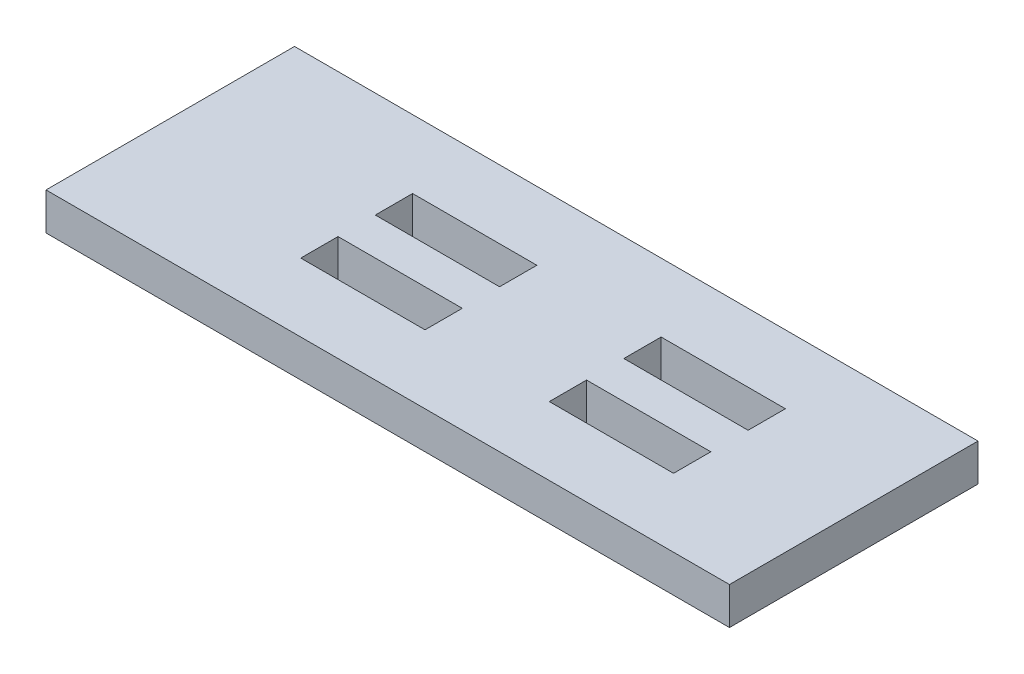
ISO-10303-21;
HEADER;
FILE_DESCRIPTION(('STEP AP214'),'2;1');
FILE_NAME('part.step','',(''),(''),'','','');
FILE_SCHEMA(('AUTOMOTIVE_DESIGN { 1 0 10303 214 1 1 1 1 }'));
ENDSEC;
DATA;
#1=APPLICATION_CONTEXT('core data for automotive mechanical design processes');
#2=APPLICATION_PROTOCOL_DEFINITION('international standard','automotive_design',2000,#1);
#3=PRODUCT_CONTEXT('',#1,'mechanical');
#4=PRODUCT('Part','Part','',(#3));
#5=PRODUCT_RELATED_PRODUCT_CATEGORY('part','',(#4));
#6=PRODUCT_DEFINITION_FORMATION('','',#4);
#7=PRODUCT_DEFINITION_CONTEXT('part definition',#1,'design');
#8=PRODUCT_DEFINITION('design','',#6,#7);
#9=PRODUCT_DEFINITION_SHAPE('','',#8);
#10=(LENGTH_UNIT() NAMED_UNIT(*) SI_UNIT(.MILLI.,.METRE.));
#11=(NAMED_UNIT(*) PLANE_ANGLE_UNIT() SI_UNIT($,.RADIAN.));
#12=(NAMED_UNIT(*) SI_UNIT($,.STERADIAN.) SOLID_ANGLE_UNIT());
#13=UNCERTAINTY_MEASURE_WITH_UNIT(LENGTH_MEASURE(1.E-05),#10,'distance_accuracy_value','');
#14=(GEOMETRIC_REPRESENTATION_CONTEXT(3) GLOBAL_UNCERTAINTY_ASSIGNED_CONTEXT((#13)) GLOBAL_UNIT_ASSIGNED_CONTEXT((#10,
#11,#12)) REPRESENTATION_CONTEXT('',''));
#15=CARTESIAN_POINT('',(0.,0.,0.));
#16=DIRECTION('',(0.,0.,1.));
#17=DIRECTION('',(1.,0.,0.));
#18=AXIS2_PLACEMENT_3D('',#15,#16,#17);
#19=CARTESIAN_POINT('',(0.,3.,0.));
#20=DIRECTION('',(-1.,0.,0.));
#21=DIRECTION('',(0.,0.,1.));
#22=AXIS2_PLACEMENT_3D('',#19,#20,#21);
#23=PLANE('',#22);
#24=DIRECTION('',(0.,0.,-1.));
#25=VECTOR('',#24,1.);
#26=CARTESIAN_POINT('',(0.,0.,0.));
#27=LINE('',#26,#25);
#28=CARTESIAN_POINT('',(0.,0.,0.));
#29=VERTEX_POINT('',#28);
#30=CARTESIAN_POINT('',(0.,0.,-20.));
#31=VERTEX_POINT('',#30);
#32=EDGE_CURVE('E296',#29,#31,#27,.T.);
#33=ORIENTED_EDGE('',*,*,#32,.T.);
#34=DIRECTION('',(0.,-1.,0.));
#35=VECTOR('',#34,1.);
#36=CARTESIAN_POINT('',(0.,3.,-20.));
#37=LINE('',#36,#35);
#38=CARTESIAN_POINT('',(0.,3.,-20.));
#39=VERTEX_POINT('',#38);
#40=EDGE_CURVE('E11',#39,#31,#37,.T.);
#41=ORIENTED_EDGE('',*,*,#40,.F.);
#42=DIRECTION('',(0.,0.,-1.));
#43=VECTOR('',#42,1.);
#44=CARTESIAN_POINT('',(0.,3.,0.));
#45=LINE('',#44,#43);
#46=CARTESIAN_POINT('',(0.,3.,0.));
#47=VERTEX_POINT('',#46);
#48=EDGE_CURVE('E303',#47,#39,#45,.T.);
#49=ORIENTED_EDGE('',*,*,#48,.F.);
#50=DIRECTION('',(0.,-1.,0.));
#51=VECTOR('',#50,1.);
#52=CARTESIAN_POINT('',(0.,3.,0.));
#53=LINE('',#52,#51);
#54=EDGE_CURVE('E313',#47,#29,#53,.T.);
#55=ORIENTED_EDGE('',*,*,#54,.T.);
#56=EDGE_LOOP('',(#33,#41,#49,#55));
#57=FACE_BOUND('',#56,.T.);
#58=ADVANCED_FACE('F34',(#57),#23,.F.);
#59=CARTESIAN_POINT('',(0.,3.,-20.));
#60=DIRECTION('',(0.,0.,1.));
#61=DIRECTION('',(1.,0.,0.));
#62=AXIS2_PLACEMENT_3D('',#59,#60,#61);
#63=PLANE('',#62);
#64=DIRECTION('',(-1.,0.,0.));
#65=VECTOR('',#64,1.);
#66=CARTESIAN_POINT('',(0.,0.,-20.));
#67=LINE('',#66,#65);
#68=CARTESIAN_POINT('',(-55.,0.,-20.));
#69=VERTEX_POINT('',#68);
#70=EDGE_CURVE('E316',#31,#69,#67,.T.);
#71=ORIENTED_EDGE('',*,*,#70,.T.);
#72=DIRECTION('',(0.,-1.,0.));
#73=VECTOR('',#72,1.);
#74=CARTESIAN_POINT('',(-55.,3.,-20.));
#75=LINE('',#74,#73);
#76=CARTESIAN_POINT('',(-55.,3.,-20.));
#77=VERTEX_POINT('',#76);
#78=EDGE_CURVE('E41',#77,#69,#75,.T.);
#79=ORIENTED_EDGE('',*,*,#78,.F.);
#80=DIRECTION('',(-1.,0.,0.));
#81=VECTOR('',#80,1.);
#82=CARTESIAN_POINT('',(0.,3.,-20.));
#83=LINE('',#82,#81);
#84=EDGE_CURVE('E306',#39,#77,#83,.T.);
#85=ORIENTED_EDGE('',*,*,#84,.F.);
#86=ORIENTED_EDGE('',*,*,#40,.T.);
#87=EDGE_LOOP('',(#71,#79,#85,#86));
#88=FACE_BOUND('',#87,.T.);
#89=ADVANCED_FACE('F345',(#88),#63,.F.);
#90=CARTESIAN_POINT('',(-55.,3.,0.));
#91=DIRECTION('',(1.,0.,0.));
#92=DIRECTION('',(0.,0.,-1.));
#93=AXIS2_PLACEMENT_3D('',#90,#91,#92);
#94=PLANE('',#93);
#95=DIRECTION('',(0.,0.,1.));
#96=VECTOR('',#95,1.);
#97=CARTESIAN_POINT('',(-55.,0.,0.));
#98=LINE('',#97,#96);
#99=CARTESIAN_POINT('',(-55.,0.,0.));
#100=VERTEX_POINT('',#99);
#101=EDGE_CURVE('E318',#69,#100,#98,.T.);
#102=ORIENTED_EDGE('',*,*,#101,.T.);
#103=DIRECTION('',(0.,-1.,0.));
#104=VECTOR('',#103,1.);
#105=CARTESIAN_POINT('',(-55.,3.,0.));
#106=LINE('',#105,#104);
#107=CARTESIAN_POINT('',(-55.,3.,0.));
#108=VERTEX_POINT('',#107);
#109=EDGE_CURVE('E323',#108,#100,#106,.T.);
#110=ORIENTED_EDGE('',*,*,#109,.F.);
#111=DIRECTION('',(0.,0.,1.));
#112=VECTOR('',#111,1.);
#113=CARTESIAN_POINT('',(-55.,3.,0.));
#114=LINE('',#113,#112);
#115=EDGE_CURVE('E309',#77,#108,#114,.T.);
#116=ORIENTED_EDGE('',*,*,#115,.F.);
#117=ORIENTED_EDGE('',*,*,#78,.T.);
#118=EDGE_LOOP('',(#102,#110,#116,#117));
#119=FACE_BOUND('',#118,.T.);
#120=ADVANCED_FACE('F330',(#119),#94,.F.);
#121=CARTESIAN_POINT('',(0.,3.,0.));
#122=DIRECTION('',(0.,0.,-1.));
#123=DIRECTION('',(-1.,0.,0.));
#124=AXIS2_PLACEMENT_3D('',#121,#122,#123);
#125=PLANE('',#124);
#126=DIRECTION('',(1.,0.,0.));
#127=VECTOR('',#126,1.);
#128=CARTESIAN_POINT('',(0.,0.,0.));
#129=LINE('',#128,#127);
#130=EDGE_CURVE('E307',#100,#29,#129,.T.);
#131=ORIENTED_EDGE('',*,*,#130,.T.);
#132=ORIENTED_EDGE('',*,*,#54,.F.);
#133=DIRECTION('',(1.,0.,0.));
#134=VECTOR('',#133,1.);
#135=CARTESIAN_POINT('',(0.,3.,0.));
#136=LINE('',#135,#134);
#137=EDGE_CURVE('E311',#108,#47,#136,.T.);
#138=ORIENTED_EDGE('',*,*,#137,.F.);
#139=ORIENTED_EDGE('',*,*,#109,.T.);
#140=EDGE_LOOP('',(#131,#132,#138,#139));
#141=FACE_BOUND('',#140,.T.);
#142=ADVANCED_FACE('F338',(#141),#125,.F.);
#143=CARTESIAN_POINT('',(0.,3.,0.));
#144=DIRECTION('',(0.,1.,0.));
#145=DIRECTION('',(0.,0.,1.));
#146=AXIS2_PLACEMENT_3D('',#143,#144,#145);
#147=PLANE('',#146);
#148=DIRECTION('',(0.,0.,-1.));
#149=VECTOR('',#148,1.);
#150=CARTESIAN_POINT('',(-30.,3.,-5.5));
#151=LINE('',#150,#149);
#152=CARTESIAN_POINT('',(-30.,3.,-5.5));
#153=VERTEX_POINT('',#152);
#154=CARTESIAN_POINT('',(-30.,3.,-8.5));
#155=VERTEX_POINT('',#154);
#156=EDGE_CURVE('E48',#153,#155,#151,.T.);
#157=ORIENTED_EDGE('',*,*,#156,.F.);
#158=DIRECTION('',(1.,0.,0.));
#159=VECTOR('',#158,1.);
#160=CARTESIAN_POINT('',(-30.,3.,-5.5));
#161=LINE('',#160,#159);
#162=CARTESIAN_POINT('',(-40.,3.,-5.5));
#163=VERTEX_POINT('',#162);
#164=EDGE_CURVE('E188',#163,#153,#161,.T.);
#165=ORIENTED_EDGE('',*,*,#164,.F.);
#166=DIRECTION('',(0.,0.,1.));
#167=VECTOR('',#166,1.);
#168=CARTESIAN_POINT('',(-40.,3.,-5.5));
#169=LINE('',#168,#167);
#170=CARTESIAN_POINT('',(-40.,3.,-8.5));
#171=VERTEX_POINT('',#170);
#172=EDGE_CURVE('E191',#171,#163,#169,.T.);
#173=ORIENTED_EDGE('',*,*,#172,.F.);
#174=DIRECTION('',(-1.,0.,0.));
#175=VECTOR('',#174,1.);
#176=CARTESIAN_POINT('',(-30.,3.,-8.5));
#177=LINE('',#176,#175);
#178=EDGE_CURVE('E197',#155,#171,#177,.T.);
#179=ORIENTED_EDGE('',*,*,#178,.F.);
#180=EDGE_LOOP('',(#157,#165,#173,#179));
#181=FACE_BOUND('',#180,.T.);
#182=DIRECTION('',(0.,0.,-1.));
#183=VECTOR('',#182,1.);
#184=CARTESIAN_POINT('',(-10.,3.,-5.5));
#185=LINE('',#184,#183);
#186=CARTESIAN_POINT('',(-10.,3.,-5.5));
#187=VERTEX_POINT('',#186);
#188=CARTESIAN_POINT('',(-10.,3.,-8.5));
#189=VERTEX_POINT('',#188);
#190=EDGE_CURVE('E203',#187,#189,#185,.T.);
#191=ORIENTED_EDGE('',*,*,#190,.F.);
#192=DIRECTION('',(1.,0.,0.));
#193=VECTOR('',#192,1.);
#194=CARTESIAN_POINT('',(-10.,3.,-5.5));
#195=LINE('',#194,#193);
#196=CARTESIAN_POINT('',(-20.,3.,-5.5));
#197=VERTEX_POINT('',#196);
#198=EDGE_CURVE('E211',#197,#187,#195,.T.);
#199=ORIENTED_EDGE('',*,*,#198,.F.);
#200=DIRECTION('',(0.,0.,1.));
#201=VECTOR('',#200,1.);
#202=CARTESIAN_POINT('',(-20.,3.,-5.5));
#203=LINE('',#202,#201);
#204=CARTESIAN_POINT('',(-20.,3.,-8.5));
#205=VERTEX_POINT('',#204);
#206=EDGE_CURVE('E225',#205,#197,#203,.T.);
#207=ORIENTED_EDGE('',*,*,#206,.F.);
#208=DIRECTION('',(-1.,0.,0.));
#209=VECTOR('',#208,1.);
#210=CARTESIAN_POINT('',(-10.,3.,-8.5));
#211=LINE('',#210,#209);
#212=EDGE_CURVE('E222',#189,#205,#211,.T.);
#213=ORIENTED_EDGE('',*,*,#212,.F.);
#214=EDGE_LOOP('',(#191,#199,#207,#213));
#215=FACE_BOUND('',#214,.T.);
#216=DIRECTION('',(0.,0.,-1.));
#217=VECTOR('',#216,1.);
#218=CARTESIAN_POINT('',(-30.,3.,-11.5));
#219=LINE('',#218,#217);
#220=CARTESIAN_POINT('',(-30.,3.,-11.5));
#221=VERTEX_POINT('',#220);
#222=CARTESIAN_POINT('',(-30.,3.,-14.5));
#223=VERTEX_POINT('',#222);
#224=EDGE_CURVE('E232',#221,#223,#219,.T.);
#225=ORIENTED_EDGE('',*,*,#224,.F.);
#226=DIRECTION('',(1.,0.,0.));
#227=VECTOR('',#226,1.);
#228=CARTESIAN_POINT('',(-30.,3.,-11.5));
#229=LINE('',#228,#227);
#230=CARTESIAN_POINT('',(-40.,3.,-11.5));
#231=VERTEX_POINT('',#230);
#232=EDGE_CURVE('E243',#231,#221,#229,.T.);
#233=ORIENTED_EDGE('',*,*,#232,.F.);
#234=DIRECTION('',(0.,0.,1.));
#235=VECTOR('',#234,1.);
#236=CARTESIAN_POINT('',(-40.,3.,-11.5));
#237=LINE('',#236,#235);
#238=CARTESIAN_POINT('',(-40.,3.,-14.5));
#239=VERTEX_POINT('',#238);
#240=EDGE_CURVE('E257',#239,#231,#237,.T.);
#241=ORIENTED_EDGE('',*,*,#240,.F.);
#242=DIRECTION('',(-1.,0.,0.));
#243=VECTOR('',#242,1.);
#244=CARTESIAN_POINT('',(-30.,3.,-14.5));
#245=LINE('',#244,#243);
#246=EDGE_CURVE('E254',#223,#239,#245,.T.);
#247=ORIENTED_EDGE('',*,*,#246,.F.);
#248=EDGE_LOOP('',(#225,#233,#241,#247));
#249=FACE_BOUND('',#248,.T.);
#250=DIRECTION('',(0.,0.,1.));
#251=VECTOR('',#250,1.);
#252=CARTESIAN_POINT('',(-20.,3.,-14.5));
#253=LINE('',#252,#251);
#254=CARTESIAN_POINT('',(-20.,3.,-14.5));
#255=VERTEX_POINT('',#254);
#256=CARTESIAN_POINT('',(-20.,3.,-11.5));
#257=VERTEX_POINT('',#256);
#258=EDGE_CURVE('E264',#255,#257,#253,.T.);
#259=ORIENTED_EDGE('',*,*,#258,.F.);
#260=DIRECTION('',(-1.,0.,0.));
#261=VECTOR('',#260,1.);
#262=CARTESIAN_POINT('',(-20.,3.,-14.5));
#263=LINE('',#262,#261);
#264=CARTESIAN_POINT('',(-10.,3.,-14.5));
#265=VERTEX_POINT('',#264);
#266=EDGE_CURVE('E275',#265,#255,#263,.T.);
#267=ORIENTED_EDGE('',*,*,#266,.F.);
#268=DIRECTION('',(0.,0.,-1.));
#269=VECTOR('',#268,1.);
#270=CARTESIAN_POINT('',(-10.,3.,-14.5));
#271=LINE('',#270,#269);
#272=CARTESIAN_POINT('',(-10.,3.,-11.5));
#273=VERTEX_POINT('',#272);
#274=EDGE_CURVE('E289',#273,#265,#271,.T.);
#275=ORIENTED_EDGE('',*,*,#274,.F.);
#276=DIRECTION('',(1.,0.,0.));
#277=VECTOR('',#276,1.);
#278=CARTESIAN_POINT('',(-20.,3.,-11.5));
#279=LINE('',#278,#277);
#280=EDGE_CURVE('E286',#257,#273,#279,.T.);
#281=ORIENTED_EDGE('',*,*,#280,.F.);
#282=EDGE_LOOP('',(#259,#267,#275,#281));
#283=FACE_BOUND('',#282,.T.);
#284=ORIENTED_EDGE('',*,*,#48,.T.);
#285=ORIENTED_EDGE('',*,*,#84,.T.);
#286=ORIENTED_EDGE('',*,*,#115,.T.);
#287=ORIENTED_EDGE('',*,*,#137,.T.);
#288=EDGE_LOOP('',(#284,#285,#286,#287));
#289=FACE_BOUND('',#288,.T.);
#290=ADVANCED_FACE('F344',(#181,#215,#249,#283,#289),#147,.T.);
#291=CARTESIAN_POINT('',(0.,0.,0.));
#292=DIRECTION('',(0.,1.,0.));
#293=DIRECTION('',(0.,0.,1.));
#294=AXIS2_PLACEMENT_3D('',#291,#292,#293);
#295=PLANE('',#294);
#296=DIRECTION('',(1.,0.,0.));
#297=VECTOR('',#296,1.);
#298=CARTESIAN_POINT('',(-30.,0.,-5.5));
#299=LINE('',#298,#297);
#300=CARTESIAN_POINT('',(-40.,0.,-5.5));
#301=VERTEX_POINT('',#300);
#302=CARTESIAN_POINT('',(-30.,0.,-5.5));
#303=VERTEX_POINT('',#302);
#304=EDGE_CURVE('E178',#301,#303,#299,.T.);
#305=ORIENTED_EDGE('',*,*,#304,.T.);
#306=DIRECTION('',(0.,0.,-1.));
#307=VECTOR('',#306,1.);
#308=CARTESIAN_POINT('',(-30.,0.,-5.5));
#309=LINE('',#308,#307);
#310=CARTESIAN_POINT('',(-30.,0.,-8.5));
#311=VERTEX_POINT('',#310);
#312=EDGE_CURVE('E172',#303,#311,#309,.T.);
#313=ORIENTED_EDGE('',*,*,#312,.T.);
#314=DIRECTION('',(-1.,0.,0.));
#315=VECTOR('',#314,1.);
#316=CARTESIAN_POINT('',(-30.,0.,-8.5));
#317=LINE('',#316,#315);
#318=CARTESIAN_POINT('',(-40.,0.,-8.5));
#319=VERTEX_POINT('',#318);
#320=EDGE_CURVE('E181',#311,#319,#317,.T.);
#321=ORIENTED_EDGE('',*,*,#320,.T.);
#322=DIRECTION('',(0.,0.,1.));
#323=VECTOR('',#322,1.);
#324=CARTESIAN_POINT('',(-40.,0.,-5.5));
#325=LINE('',#324,#323);
#326=EDGE_CURVE('E56',#319,#301,#325,.T.);
#327=ORIENTED_EDGE('',*,*,#326,.T.);
#328=EDGE_LOOP('',(#305,#313,#321,#327));
#329=FACE_BOUND('',#328,.T.);
#330=DIRECTION('',(1.,0.,0.));
#331=VECTOR('',#330,1.);
#332=CARTESIAN_POINT('',(-10.,0.,-5.5));
#333=LINE('',#332,#331);
#334=CARTESIAN_POINT('',(-20.,0.,-5.5));
#335=VERTEX_POINT('',#334);
#336=CARTESIAN_POINT('',(-10.,0.,-5.5));
#337=VERTEX_POINT('',#336);
#338=EDGE_CURVE('E217',#335,#337,#333,.T.);
#339=ORIENTED_EDGE('',*,*,#338,.T.);
#340=DIRECTION('',(0.,0.,-1.));
#341=VECTOR('',#340,1.);
#342=CARTESIAN_POINT('',(-10.,0.,-5.5));
#343=LINE('',#342,#341);
#344=CARTESIAN_POINT('',(-10.,0.,-8.5));
#345=VERTEX_POINT('',#344);
#346=EDGE_CURVE('E207',#337,#345,#343,.T.);
#347=ORIENTED_EDGE('',*,*,#346,.T.);
#348=DIRECTION('',(-1.,0.,0.));
#349=VECTOR('',#348,1.);
#350=CARTESIAN_POINT('',(-10.,0.,-8.5));
#351=LINE('',#350,#349);
#352=CARTESIAN_POINT('',(-20.,0.,-8.5));
#353=VERTEX_POINT('',#352);
#354=EDGE_CURVE('E210',#345,#353,#351,.T.);
#355=ORIENTED_EDGE('',*,*,#354,.T.);
#356=DIRECTION('',(0.,0.,1.));
#357=VECTOR('',#356,1.);
#358=CARTESIAN_POINT('',(-20.,0.,-5.5));
#359=LINE('',#358,#357);
#360=EDGE_CURVE('E214',#353,#335,#359,.T.);
#361=ORIENTED_EDGE('',*,*,#360,.T.);
#362=EDGE_LOOP('',(#339,#347,#355,#361));
#363=FACE_BOUND('',#362,.T.);
#364=DIRECTION('',(1.,0.,0.));
#365=VECTOR('',#364,1.);
#366=CARTESIAN_POINT('',(-30.,0.,-11.5));
#367=LINE('',#366,#365);
#368=CARTESIAN_POINT('',(-40.,0.,-11.5));
#369=VERTEX_POINT('',#368);
#370=CARTESIAN_POINT('',(-30.,0.,-11.5));
#371=VERTEX_POINT('',#370);
#372=EDGE_CURVE('E249',#369,#371,#367,.T.);
#373=ORIENTED_EDGE('',*,*,#372,.T.);
#374=DIRECTION('',(0.,0.,-1.));
#375=VECTOR('',#374,1.);
#376=CARTESIAN_POINT('',(-30.,0.,-11.5));
#377=LINE('',#376,#375);
#378=CARTESIAN_POINT('',(-30.,0.,-14.5));
#379=VERTEX_POINT('',#378);
#380=EDGE_CURVE('E239',#371,#379,#377,.T.);
#381=ORIENTED_EDGE('',*,*,#380,.T.);
#382=DIRECTION('',(-1.,0.,0.));
#383=VECTOR('',#382,1.);
#384=CARTESIAN_POINT('',(-30.,0.,-14.5));
#385=LINE('',#384,#383);
#386=CARTESIAN_POINT('',(-40.,0.,-14.5));
#387=VERTEX_POINT('',#386);
#388=EDGE_CURVE('E242',#379,#387,#385,.T.);
#389=ORIENTED_EDGE('',*,*,#388,.T.);
#390=DIRECTION('',(0.,0.,1.));
#391=VECTOR('',#390,1.);
#392=CARTESIAN_POINT('',(-40.,0.,-11.5));
#393=LINE('',#392,#391);
#394=EDGE_CURVE('E246',#387,#369,#393,.T.);
#395=ORIENTED_EDGE('',*,*,#394,.T.);
#396=EDGE_LOOP('',(#373,#381,#389,#395));
#397=FACE_BOUND('',#396,.T.);
#398=DIRECTION('',(-1.,0.,0.));
#399=VECTOR('',#398,1.);
#400=CARTESIAN_POINT('',(-20.,0.,-14.5));
#401=LINE('',#400,#399);
#402=CARTESIAN_POINT('',(-10.,0.,-14.5));
#403=VERTEX_POINT('',#402);
#404=CARTESIAN_POINT('',(-20.,0.,-14.5));
#405=VERTEX_POINT('',#404);
#406=EDGE_CURVE('E281',#403,#405,#401,.T.);
#407=ORIENTED_EDGE('',*,*,#406,.T.);
#408=DIRECTION('',(0.,0.,1.));
#409=VECTOR('',#408,1.);
#410=CARTESIAN_POINT('',(-20.,0.,-14.5));
#411=LINE('',#410,#409);
#412=CARTESIAN_POINT('',(-20.,0.,-11.5));
#413=VERTEX_POINT('',#412);
#414=EDGE_CURVE('E271',#405,#413,#411,.T.);
#415=ORIENTED_EDGE('',*,*,#414,.T.);
#416=DIRECTION('',(1.,0.,0.));
#417=VECTOR('',#416,1.);
#418=CARTESIAN_POINT('',(-20.,0.,-11.5));
#419=LINE('',#418,#417);
#420=CARTESIAN_POINT('',(-10.,0.,-11.5));
#421=VERTEX_POINT('',#420);
#422=EDGE_CURVE('E274',#413,#421,#419,.T.);
#423=ORIENTED_EDGE('',*,*,#422,.T.);
#424=DIRECTION('',(0.,0.,-1.));
#425=VECTOR('',#424,1.);
#426=CARTESIAN_POINT('',(-10.,0.,-14.5));
#427=LINE('',#426,#425);
#428=EDGE_CURVE('E278',#421,#403,#427,.T.);
#429=ORIENTED_EDGE('',*,*,#428,.T.);
#430=EDGE_LOOP('',(#407,#415,#423,#429));
#431=FACE_BOUND('',#430,.T.);
#432=ORIENTED_EDGE('',*,*,#32,.F.);
#433=ORIENTED_EDGE('',*,*,#130,.F.);
#434=ORIENTED_EDGE('',*,*,#101,.F.);
#435=ORIENTED_EDGE('',*,*,#70,.F.);
#436=EDGE_LOOP('',(#432,#433,#434,#435));
#437=FACE_BOUND('',#436,.T.);
#438=ADVANCED_FACE('F185',(#329,#363,#397,#431,#437),#295,.F.);
#439=CARTESIAN_POINT('',(-20.,0.,-14.5));
#440=DIRECTION('',(-1.,0.,0.));
#441=DIRECTION('',(0.,0.,1.));
#442=AXIS2_PLACEMENT_3D('',#439,#440,#441);
#443=PLANE('',#442);
#444=ORIENTED_EDGE('',*,*,#258,.T.);
#445=DIRECTION('',(0.,1.,0.));
#446=VECTOR('',#445,1.);
#447=CARTESIAN_POINT('',(-20.,0.,-11.5));
#448=LINE('',#447,#446);
#449=EDGE_CURVE('E284',#413,#257,#448,.T.);
#450=ORIENTED_EDGE('',*,*,#449,.F.);
#451=ORIENTED_EDGE('',*,*,#414,.F.);
#452=DIRECTION('',(0.,1.,0.));
#453=VECTOR('',#452,1.);
#454=CARTESIAN_POINT('',(-20.,0.,-14.5));
#455=LINE('',#454,#453);
#456=EDGE_CURVE('E294',#405,#255,#455,.T.);
#457=ORIENTED_EDGE('',*,*,#456,.T.);
#458=EDGE_LOOP('',(#444,#450,#451,#457));
#459=FACE_BOUND('',#458,.T.);
#460=ADVANCED_FACE('F357',(#459),#443,.F.);
#461=CARTESIAN_POINT('',(-20.,0.,-14.5));
#462=DIRECTION('',(0.,0.,-1.));
#463=DIRECTION('',(-1.,0.,0.));
#464=AXIS2_PLACEMENT_3D('',#461,#462,#463);
#465=PLANE('',#464);
#466=ORIENTED_EDGE('',*,*,#266,.T.);
#467=ORIENTED_EDGE('',*,*,#456,.F.);
#468=ORIENTED_EDGE('',*,*,#406,.F.);
#469=DIRECTION('',(0.,1.,0.));
#470=VECTOR('',#469,1.);
#471=CARTESIAN_POINT('',(-10.,0.,-14.5));
#472=LINE('',#471,#470);
#473=EDGE_CURVE('E297',#403,#265,#472,.T.);
#474=ORIENTED_EDGE('',*,*,#473,.T.);
#475=EDGE_LOOP('',(#466,#467,#468,#474));
#476=FACE_BOUND('',#475,.T.);
#477=ADVANCED_FACE('F363',(#476),#465,.F.);
#478=CARTESIAN_POINT('',(-10.,0.,-14.5));
#479=DIRECTION('',(1.,0.,0.));
#480=DIRECTION('',(0.,0.,-1.));
#481=AXIS2_PLACEMENT_3D('',#478,#479,#480);
#482=PLANE('',#481);
#483=ORIENTED_EDGE('',*,*,#274,.T.);
#484=ORIENTED_EDGE('',*,*,#473,.F.);
#485=ORIENTED_EDGE('',*,*,#428,.F.);
#486=DIRECTION('',(0.,1.,0.));
#487=VECTOR('',#486,1.);
#488=CARTESIAN_POINT('',(-10.,0.,-11.5));
#489=LINE('',#488,#487);
#490=EDGE_CURVE('E299',#421,#273,#489,.T.);
#491=ORIENTED_EDGE('',*,*,#490,.T.);
#492=EDGE_LOOP('',(#483,#484,#485,#491));
#493=FACE_BOUND('',#492,.T.);
#494=ADVANCED_FACE('F369',(#493),#482,.F.);
#495=CARTESIAN_POINT('',(-20.,0.,-11.5));
#496=DIRECTION('',(0.,0.,1.));
#497=DIRECTION('',(1.,0.,0.));
#498=AXIS2_PLACEMENT_3D('',#495,#496,#497);
#499=PLANE('',#498);
#500=ORIENTED_EDGE('',*,*,#280,.T.);
#501=ORIENTED_EDGE('',*,*,#490,.F.);
#502=ORIENTED_EDGE('',*,*,#422,.F.);
#503=ORIENTED_EDGE('',*,*,#449,.T.);
#504=EDGE_LOOP('',(#500,#501,#502,#503));
#505=FACE_BOUND('',#504,.T.);
#506=ADVANCED_FACE('F365',(#505),#499,.F.);
#507=CARTESIAN_POINT('',(-30.,0.,-11.5));
#508=DIRECTION('',(1.,0.,0.));
#509=DIRECTION('',(0.,0.,-1.));
#510=AXIS2_PLACEMENT_3D('',#507,#508,#509);
#511=PLANE('',#510);
#512=ORIENTED_EDGE('',*,*,#224,.T.);
#513=DIRECTION('',(0.,1.,0.));
#514=VECTOR('',#513,1.);
#515=CARTESIAN_POINT('',(-30.,0.,-14.5));
#516=LINE('',#515,#514);
#517=EDGE_CURVE('E252',#379,#223,#516,.T.);
#518=ORIENTED_EDGE('',*,*,#517,.F.);
#519=ORIENTED_EDGE('',*,*,#380,.F.);
#520=DIRECTION('',(0.,1.,0.));
#521=VECTOR('',#520,1.);
#522=CARTESIAN_POINT('',(-30.,0.,-11.5));
#523=LINE('',#522,#521);
#524=EDGE_CURVE('E262',#371,#221,#523,.T.);
#525=ORIENTED_EDGE('',*,*,#524,.T.);
#526=EDGE_LOOP('',(#512,#518,#519,#525));
#527=FACE_BOUND('',#526,.T.);
#528=ADVANCED_FACE('F368',(#527),#511,.F.);
#529=CARTESIAN_POINT('',(-30.,0.,-11.5));
#530=DIRECTION('',(0.,0.,1.));
#531=DIRECTION('',(1.,0.,0.));
#532=AXIS2_PLACEMENT_3D('',#529,#530,#531);
#533=PLANE('',#532);
#534=ORIENTED_EDGE('',*,*,#232,.T.);
#535=ORIENTED_EDGE('',*,*,#524,.F.);
#536=ORIENTED_EDGE('',*,*,#372,.F.);
#537=DIRECTION('',(0.,1.,0.));
#538=VECTOR('',#537,1.);
#539=CARTESIAN_POINT('',(-40.,0.,-11.5));
#540=LINE('',#539,#538);
#541=EDGE_CURVE('E265',#369,#231,#540,.T.);
#542=ORIENTED_EDGE('',*,*,#541,.T.);
#543=EDGE_LOOP('',(#534,#535,#536,#542));
#544=FACE_BOUND('',#543,.T.);
#545=ADVANCED_FACE('F379',(#544),#533,.F.);
#546=CARTESIAN_POINT('',(-40.,0.,-11.5));
#547=DIRECTION('',(-1.,0.,0.));
#548=DIRECTION('',(0.,0.,1.));
#549=AXIS2_PLACEMENT_3D('',#546,#547,#548);
#550=PLANE('',#549);
#551=ORIENTED_EDGE('',*,*,#240,.T.);
#552=ORIENTED_EDGE('',*,*,#541,.F.);
#553=ORIENTED_EDGE('',*,*,#394,.F.);
#554=DIRECTION('',(0.,1.,0.));
#555=VECTOR('',#554,1.);
#556=CARTESIAN_POINT('',(-40.,0.,-14.5));
#557=LINE('',#556,#555);
#558=EDGE_CURVE('E267',#387,#239,#557,.T.);
#559=ORIENTED_EDGE('',*,*,#558,.T.);
#560=EDGE_LOOP('',(#551,#552,#553,#559));
#561=FACE_BOUND('',#560,.T.);
#562=ADVANCED_FACE('F385',(#561),#550,.F.);
#563=CARTESIAN_POINT('',(-30.,0.,-14.5));
#564=DIRECTION('',(0.,0.,-1.));
#565=DIRECTION('',(-1.,0.,0.));
#566=AXIS2_PLACEMENT_3D('',#563,#564,#565);
#567=PLANE('',#566);
#568=ORIENTED_EDGE('',*,*,#246,.T.);
#569=ORIENTED_EDGE('',*,*,#558,.F.);
#570=ORIENTED_EDGE('',*,*,#388,.F.);
#571=ORIENTED_EDGE('',*,*,#517,.T.);
#572=EDGE_LOOP('',(#568,#569,#570,#571));
#573=FACE_BOUND('',#572,.T.);
#574=ADVANCED_FACE('F381',(#573),#567,.F.);
#575=CARTESIAN_POINT('',(-10.,0.,-5.5));
#576=DIRECTION('',(1.,0.,0.));
#577=DIRECTION('',(0.,0.,-1.));
#578=AXIS2_PLACEMENT_3D('',#575,#576,#577);
#579=PLANE('',#578);
#580=ORIENTED_EDGE('',*,*,#190,.T.);
#581=DIRECTION('',(0.,1.,0.));
#582=VECTOR('',#581,1.);
#583=CARTESIAN_POINT('',(-10.,0.,-8.5));
#584=LINE('',#583,#582);
#585=EDGE_CURVE('E220',#345,#189,#584,.T.);
#586=ORIENTED_EDGE('',*,*,#585,.F.);
#587=ORIENTED_EDGE('',*,*,#346,.F.);
#588=DIRECTION('',(0.,1.,0.));
#589=VECTOR('',#588,1.);
#590=CARTESIAN_POINT('',(-10.,0.,-5.5));
#591=LINE('',#590,#589);
#592=EDGE_CURVE('E230',#337,#187,#591,.T.);
#593=ORIENTED_EDGE('',*,*,#592,.T.);
#594=EDGE_LOOP('',(#580,#586,#587,#593));
#595=FACE_BOUND('',#594,.T.);
#596=ADVANCED_FACE('F384',(#595),#579,.F.);
#597=CARTESIAN_POINT('',(-10.,0.,-5.5));
#598=DIRECTION('',(0.,0.,1.));
#599=DIRECTION('',(1.,0.,0.));
#600=AXIS2_PLACEMENT_3D('',#597,#598,#599);
#601=PLANE('',#600);
#602=ORIENTED_EDGE('',*,*,#198,.T.);
#603=ORIENTED_EDGE('',*,*,#592,.F.);
#604=ORIENTED_EDGE('',*,*,#338,.F.);
#605=DIRECTION('',(0.,1.,0.));
#606=VECTOR('',#605,1.);
#607=CARTESIAN_POINT('',(-20.,0.,-5.5));
#608=LINE('',#607,#606);
#609=EDGE_CURVE('E233',#335,#197,#608,.T.);
#610=ORIENTED_EDGE('',*,*,#609,.T.);
#611=EDGE_LOOP('',(#602,#603,#604,#610));
#612=FACE_BOUND('',#611,.T.);
#613=ADVANCED_FACE('F395',(#612),#601,.F.);
#614=CARTESIAN_POINT('',(-20.,0.,-5.5));
#615=DIRECTION('',(-1.,0.,0.));
#616=DIRECTION('',(0.,0.,1.));
#617=AXIS2_PLACEMENT_3D('',#614,#615,#616);
#618=PLANE('',#617);
#619=ORIENTED_EDGE('',*,*,#206,.T.);
#620=ORIENTED_EDGE('',*,*,#609,.F.);
#621=ORIENTED_EDGE('',*,*,#360,.F.);
#622=DIRECTION('',(0.,1.,0.));
#623=VECTOR('',#622,1.);
#624=CARTESIAN_POINT('',(-20.,0.,-8.5));
#625=LINE('',#624,#623);
#626=EDGE_CURVE('E235',#353,#205,#625,.T.);
#627=ORIENTED_EDGE('',*,*,#626,.T.);
#628=EDGE_LOOP('',(#619,#620,#621,#627));
#629=FACE_BOUND('',#628,.T.);
#630=ADVANCED_FACE('F400',(#629),#618,.F.);
#631=CARTESIAN_POINT('',(-10.,0.,-8.5));
#632=DIRECTION('',(0.,0.,-1.));
#633=DIRECTION('',(-1.,0.,0.));
#634=AXIS2_PLACEMENT_3D('',#631,#632,#633);
#635=PLANE('',#634);
#636=ORIENTED_EDGE('',*,*,#212,.T.);
#637=ORIENTED_EDGE('',*,*,#626,.F.);
#638=ORIENTED_EDGE('',*,*,#354,.F.);
#639=ORIENTED_EDGE('',*,*,#585,.T.);
#640=EDGE_LOOP('',(#636,#637,#638,#639));
#641=FACE_BOUND('',#640,.T.);
#642=ADVANCED_FACE('F397',(#641),#635,.F.);
#643=CARTESIAN_POINT('',(-30.,0.,-5.5));
#644=DIRECTION('',(1.,0.,0.));
#645=DIRECTION('',(0.,0.,-1.));
#646=AXIS2_PLACEMENT_3D('',#643,#644,#645);
#647=PLANE('',#646);
#648=ORIENTED_EDGE('',*,*,#156,.T.);
#649=DIRECTION('',(0.,1.,0.));
#650=VECTOR('',#649,1.);
#651=CARTESIAN_POINT('',(-30.,0.,-8.5));
#652=LINE('',#651,#650);
#653=EDGE_CURVE('E168',#311,#155,#652,.T.);
#654=ORIENTED_EDGE('',*,*,#653,.F.);
#655=ORIENTED_EDGE('',*,*,#312,.F.);
#656=DIRECTION('',(0.,1.,0.));
#657=VECTOR('',#656,1.);
#658=CARTESIAN_POINT('',(-30.,0.,-5.5));
#659=LINE('',#658,#657);
#660=EDGE_CURVE('E201',#303,#153,#659,.T.);
#661=ORIENTED_EDGE('',*,*,#660,.T.);
#662=EDGE_LOOP('',(#648,#654,#655,#661));
#663=FACE_BOUND('',#662,.T.);
#664=ADVANCED_FACE('F170',(#663),#647,.F.);
#665=CARTESIAN_POINT('',(-30.,0.,-5.5));
#666=DIRECTION('',(0.,0.,1.));
#667=DIRECTION('',(1.,0.,0.));
#668=AXIS2_PLACEMENT_3D('',#665,#666,#667);
#669=PLANE('',#668);
#670=ORIENTED_EDGE('',*,*,#164,.T.);
#671=ORIENTED_EDGE('',*,*,#660,.F.);
#672=ORIENTED_EDGE('',*,*,#304,.F.);
#673=DIRECTION('',(0.,1.,0.));
#674=VECTOR('',#673,1.);
#675=CARTESIAN_POINT('',(-40.,0.,-5.5));
#676=LINE('',#675,#674);
#677=EDGE_CURVE('E204',#301,#163,#676,.T.);
#678=ORIENTED_EDGE('',*,*,#677,.T.);
#679=EDGE_LOOP('',(#670,#671,#672,#678));
#680=FACE_BOUND('',#679,.T.);
#681=ADVANCED_FACE('F410',(#680),#669,.F.);
#682=CARTESIAN_POINT('',(-40.,0.,-5.5));
#683=DIRECTION('',(-1.,0.,0.));
#684=DIRECTION('',(0.,0.,1.));
#685=AXIS2_PLACEMENT_3D('',#682,#683,#684);
#686=PLANE('',#685);
#687=ORIENTED_EDGE('',*,*,#172,.T.);
#688=ORIENTED_EDGE('',*,*,#677,.F.);
#689=ORIENTED_EDGE('',*,*,#326,.F.);
#690=DIRECTION('',(0.,1.,0.));
#691=VECTOR('',#690,1.);
#692=CARTESIAN_POINT('',(-40.,0.,-8.5));
#693=LINE('',#692,#691);
#694=EDGE_CURVE('E177',#319,#171,#693,.T.);
#695=ORIENTED_EDGE('',*,*,#694,.T.);
#696=EDGE_LOOP('',(#687,#688,#689,#695));
#697=FACE_BOUND('',#696,.T.);
#698=ADVANCED_FACE('F413',(#697),#686,.F.);
#699=CARTESIAN_POINT('',(-30.,0.,-8.5));
#700=DIRECTION('',(0.,0.,-1.));
#701=DIRECTION('',(-1.,0.,0.));
#702=AXIS2_PLACEMENT_3D('',#699,#700,#701);
#703=PLANE('',#702);
#704=ORIENTED_EDGE('',*,*,#178,.T.);
#705=ORIENTED_EDGE('',*,*,#694,.F.);
#706=ORIENTED_EDGE('',*,*,#320,.F.);
#707=ORIENTED_EDGE('',*,*,#653,.T.);
#708=EDGE_LOOP('',(#704,#705,#706,#707));
#709=FACE_BOUND('',#708,.T.);
#710=ADVANCED_FACE('F182',(#709),#703,.F.);
#711=CLOSED_SHELL('',(#58,#89,#120,#142,#290,#438,#460,#477,#494,#506,#528,#545,#562,#574,#596,
#613,#630,#642,#664,#681,#698,#710));
#712=MANIFOLD_SOLID_BREP('B2',#711);
#713=ADVANCED_BREP_SHAPE_REPRESENTATION('',(#18,#712),#14);
#714=SHAPE_DEFINITION_REPRESENTATION(#9,#713);
ENDSEC;
END-ISO-10303-21;
